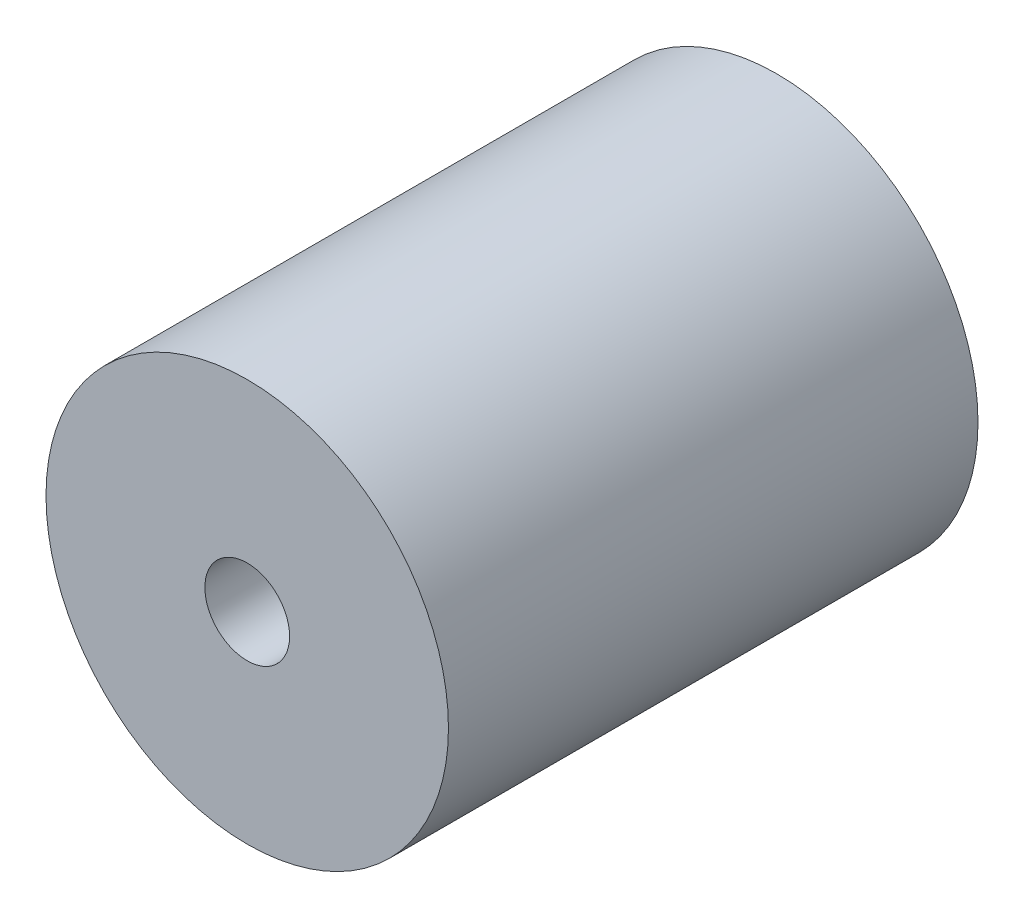
ISO-10303-21;
HEADER;
FILE_DESCRIPTION(('STEP AP214'),'2;1');
FILE_NAME('part.step','',(''),(''),'','','');
FILE_SCHEMA(('AUTOMOTIVE_DESIGN { 1 0 10303 214 1 1 1 1 }'));
ENDSEC;
DATA;
#1=APPLICATION_CONTEXT('core data for automotive mechanical design processes');
#2=APPLICATION_PROTOCOL_DEFINITION('international standard','automotive_design',2000,#1);
#3=PRODUCT_CONTEXT('',#1,'mechanical');
#4=PRODUCT('Part','Part','',(#3));
#5=PRODUCT_RELATED_PRODUCT_CATEGORY('part','',(#4));
#6=PRODUCT_DEFINITION_FORMATION('','',#4);
#7=PRODUCT_DEFINITION_CONTEXT('part definition',#1,'design');
#8=PRODUCT_DEFINITION('design','',#6,#7);
#9=PRODUCT_DEFINITION_SHAPE('','',#8);
#10=(LENGTH_UNIT() NAMED_UNIT(*) SI_UNIT(.MILLI.,.METRE.));
#11=(NAMED_UNIT(*) PLANE_ANGLE_UNIT() SI_UNIT($,.RADIAN.));
#12=(NAMED_UNIT(*) SI_UNIT($,.STERADIAN.) SOLID_ANGLE_UNIT());
#13=UNCERTAINTY_MEASURE_WITH_UNIT(LENGTH_MEASURE(1.E-05),#10,'distance_accuracy_value','');
#14=(GEOMETRIC_REPRESENTATION_CONTEXT(3) GLOBAL_UNCERTAINTY_ASSIGNED_CONTEXT((#13)) GLOBAL_UNIT_ASSIGNED_CONTEXT((#10,
#11,#12)) REPRESENTATION_CONTEXT('',''));
#15=CARTESIAN_POINT('',(0.,0.,0.));
#16=DIRECTION('',(0.,0.,1.));
#17=DIRECTION('',(1.,0.,0.));
#18=AXIS2_PLACEMENT_3D('',#15,#16,#17);
#19=CARTESIAN_POINT('',(0.,0.,25.));
#20=DIRECTION('',(0.,0.,1.));
#21=DIRECTION('',(1.,0.,0.));
#22=AXIS2_PLACEMENT_3D('',#19,#20,#21);
#23=PLANE('',#22);
#24=CARTESIAN_POINT('',(0.,0.,25.));
#25=DIRECTION('',(0.,0.,1.));
#26=DIRECTION('',(1.,0.,0.));
#27=AXIS2_PLACEMENT_3D('',#24,#25,#26);
#28=CIRCLE('',#27,9.5);
#29=CARTESIAN_POINT('',(9.5,0.,25.));
#30=VERTEX_POINT('',#29);
#31=EDGE_CURVE('E10',#30,#30,#28,.T.);
#32=ORIENTED_EDGE('',*,*,#31,.T.);
#33=EDGE_LOOP('',(#32));
#34=FACE_BOUND('',#33,.T.);
#35=CARTESIAN_POINT('',(0.,0.,25.));
#36=DIRECTION('',(0.,0.,1.));
#37=DIRECTION('',(1.,0.,0.));
#38=AXIS2_PLACEMENT_3D('',#35,#36,#37);
#39=CIRCLE('',#38,2.);
#40=CARTESIAN_POINT('',(2.,0.,25.));
#41=VERTEX_POINT('',#40);
#42=EDGE_CURVE('E52',#41,#41,#39,.T.);
#43=ORIENTED_EDGE('',*,*,#42,.F.);
#44=EDGE_LOOP('',(#43));
#45=FACE_BOUND('',#44,.T.);
#46=ADVANCED_FACE('F38',(#34,#45),#23,.T.);
#47=CARTESIAN_POINT('',(0.,0.,0.));
#48=DIRECTION('',(0.,0.,1.));
#49=DIRECTION('',(1.,0.,0.));
#50=AXIS2_PLACEMENT_3D('',#47,#48,#49);
#51=PLANE('',#50);
#52=CARTESIAN_POINT('',(0.,0.,0.));
#53=DIRECTION('',(0.,0.,1.));
#54=DIRECTION('',(1.,0.,0.));
#55=AXIS2_PLACEMENT_3D('',#52,#53,#54);
#56=CIRCLE('',#55,9.5);
#57=CARTESIAN_POINT('',(9.5,0.,0.));
#58=VERTEX_POINT('',#57);
#59=EDGE_CURVE('E42',#58,#58,#56,.T.);
#60=ORIENTED_EDGE('',*,*,#59,.F.);
#61=EDGE_LOOP('',(#60));
#62=FACE_BOUND('',#61,.T.);
#63=CARTESIAN_POINT('',(0.,0.,0.));
#64=DIRECTION('',(0.,0.,1.));
#65=DIRECTION('',(1.,0.,0.));
#66=AXIS2_PLACEMENT_3D('',#63,#64,#65);
#67=CIRCLE('',#66,2.);
#68=CARTESIAN_POINT('',(2.,0.,0.));
#69=VERTEX_POINT('',#68);
#70=EDGE_CURVE('E54',#69,#69,#67,.T.);
#71=ORIENTED_EDGE('',*,*,#70,.T.);
#72=EDGE_LOOP('',(#71));
#73=FACE_BOUND('',#72,.T.);
#74=ADVANCED_FACE('F65',(#62,#73),#51,.F.);
#75=CARTESIAN_POINT('',(0.,0.,25.));
#76=DIRECTION('',(0.,0.,-1.));
#77=DIRECTION('',(-1.,0.,0.));
#78=AXIS2_PLACEMENT_3D('',#75,#76,#77);
#79=CYLINDRICAL_SURFACE('',#78,9.5);
#80=ORIENTED_EDGE('',*,*,#31,.F.);
#81=EDGE_LOOP('',(#80));
#82=FACE_BOUND('',#81,.T.);
#83=ORIENTED_EDGE('',*,*,#59,.T.);
#84=EDGE_LOOP('',(#83));
#85=FACE_BOUND('',#84,.T.);
#86=ADVANCED_FACE('F40',(#82,#85),#79,.T.);
#87=CARTESIAN_POINT('',(0.,0.,25.));
#88=DIRECTION('',(0.,0.,-1.));
#89=DIRECTION('',(-1.,0.,0.));
#90=AXIS2_PLACEMENT_3D('',#87,#88,#89);
#91=CYLINDRICAL_SURFACE('',#90,2.);
#92=ORIENTED_EDGE('',*,*,#42,.T.);
#93=EDGE_LOOP('',(#92));
#94=FACE_BOUND('',#93,.T.);
#95=ORIENTED_EDGE('',*,*,#70,.F.);
#96=EDGE_LOOP('',(#95));
#97=FACE_BOUND('',#96,.T.);
#98=ADVANCED_FACE('F61',(#94,#97),#91,.F.);
#99=CLOSED_SHELL('',(#46,#74,#86,#98));
#100=MANIFOLD_SOLID_BREP('B2',#99);
#101=ADVANCED_BREP_SHAPE_REPRESENTATION('',(#18,#100),#14);
#102=SHAPE_DEFINITION_REPRESENTATION(#9,#101);
ENDSEC;
END-ISO-10303-21;
